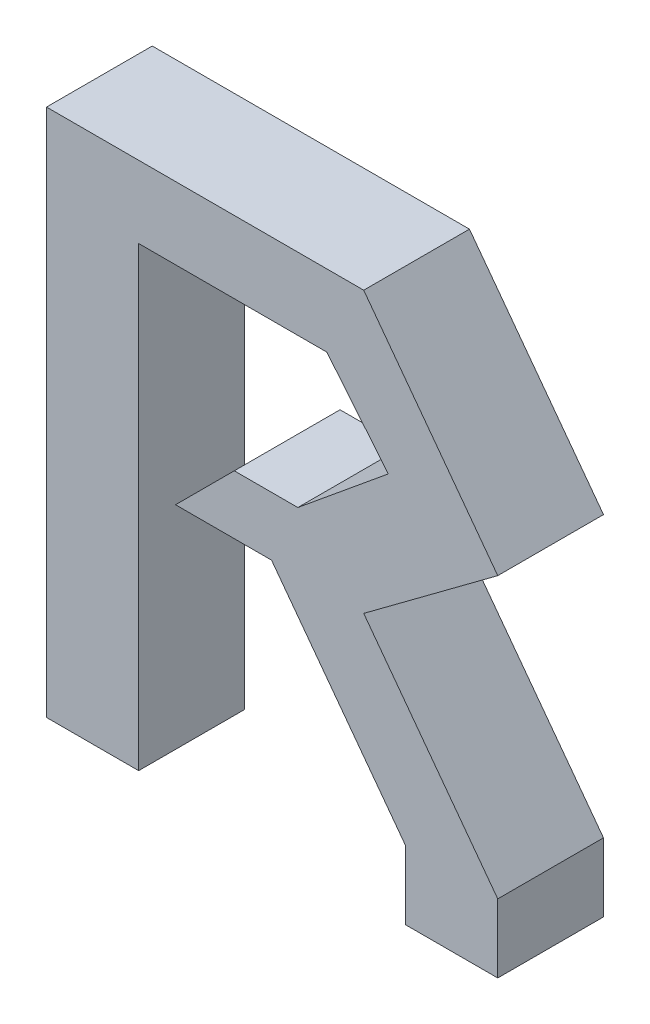
ISO-10303-21;
HEADER;
FILE_DESCRIPTION(('STEP AP214'),'2;1');
FILE_NAME('part.step','',(''),(''),'','','');
FILE_SCHEMA(('AUTOMOTIVE_DESIGN { 1 0 10303 214 1 1 1 1 }'));
ENDSEC;
DATA;
#1=APPLICATION_CONTEXT('core data for automotive mechanical design processes');
#2=APPLICATION_PROTOCOL_DEFINITION('international standard','automotive_design',2000,#1);
#3=PRODUCT_CONTEXT('',#1,'mechanical');
#4=PRODUCT('Part','Part','',(#3));
#5=PRODUCT_RELATED_PRODUCT_CATEGORY('part','',(#4));
#6=PRODUCT_DEFINITION_FORMATION('','',#4);
#7=PRODUCT_DEFINITION_CONTEXT('part definition',#1,'design');
#8=PRODUCT_DEFINITION('design','',#6,#7);
#9=PRODUCT_DEFINITION_SHAPE('','',#8);
#10=(LENGTH_UNIT() NAMED_UNIT(*) SI_UNIT(.MILLI.,.METRE.));
#11=(NAMED_UNIT(*) PLANE_ANGLE_UNIT() SI_UNIT($,.RADIAN.));
#12=(NAMED_UNIT(*) SI_UNIT($,.STERADIAN.) SOLID_ANGLE_UNIT());
#13=UNCERTAINTY_MEASURE_WITH_UNIT(LENGTH_MEASURE(1.E-05),#10,'distance_accuracy_value','');
#14=(GEOMETRIC_REPRESENTATION_CONTEXT(3) GLOBAL_UNCERTAINTY_ASSIGNED_CONTEXT((#13)) GLOBAL_UNIT_ASSIGNED_CONTEXT((#10,
#11,#12)) REPRESENTATION_CONTEXT('',''));
#15=CARTESIAN_POINT('',(0.,0.,0.));
#16=DIRECTION('',(0.,0.,1.));
#17=DIRECTION('',(1.,0.,0.));
#18=AXIS2_PLACEMENT_3D('',#15,#16,#17);
#19=CARTESIAN_POINT('',(-308.048152534404,51.5334819485926,20.));
#20=DIRECTION('',(1.,0.,0.));
#21=DIRECTION('',(0.,0.,-1.));
#22=AXIS2_PLACEMENT_3D('',#19,#20,#21);
#23=PLANE('',#22);
#24=DIRECTION('',(0.,-1.,0.));
#25=VECTOR('',#24,1.);
#26=CARTESIAN_POINT('',(-308.048152534404,51.5334819485926,0.));
#27=LINE('',#26,#25);
#28=CARTESIAN_POINT('',(-308.048152534404,51.5334819485926,0.));
#29=VERTEX_POINT('',#28);
#30=CARTESIAN_POINT('',(-308.048152534404,-48.4665180514074,0.));
#31=VERTEX_POINT('',#30);
#32=EDGE_CURVE('E185',#29,#31,#27,.T.);
#33=ORIENTED_EDGE('',*,*,#32,.T.);
#34=DIRECTION('',(0.,0.,-1.));
#35=VECTOR('',#34,1.);
#36=CARTESIAN_POINT('',(-308.048152534404,-48.4665180514074,20.));
#37=LINE('',#36,#35);
#38=CARTESIAN_POINT('',(-308.048152534404,-48.4665180514074,20.));
#39=VERTEX_POINT('',#38);
#40=EDGE_CURVE('E11',#39,#31,#37,.T.);
#41=ORIENTED_EDGE('',*,*,#40,.F.);
#42=DIRECTION('',(0.,-1.,0.));
#43=VECTOR('',#42,1.);
#44=CARTESIAN_POINT('',(-308.048152534404,51.5334819485926,20.));
#45=LINE('',#44,#43);
#46=CARTESIAN_POINT('',(-308.048152534404,51.5334819485926,20.));
#47=VERTEX_POINT('',#46);
#48=EDGE_CURVE('E227',#47,#39,#45,.T.);
#49=ORIENTED_EDGE('',*,*,#48,.F.);
#50=DIRECTION('',(0.,0.,-1.));
#51=VECTOR('',#50,1.);
#52=CARTESIAN_POINT('',(-308.048152534404,51.5334819485926,20.));
#53=LINE('',#52,#51);
#54=EDGE_CURVE('E50',#47,#29,#53,.T.);
#55=ORIENTED_EDGE('',*,*,#54,.T.);
#56=EDGE_LOOP('',(#33,#41,#49,#55));
#57=FACE_BOUND('',#56,.T.);
#58=ADVANCED_FACE('F34',(#57),#23,.F.);
#59=CARTESIAN_POINT('',(-308.048152534404,-48.4665180514074,20.));
#60=DIRECTION('',(0.,1.,0.));
#61=DIRECTION('',(0.,0.,1.));
#62=AXIS2_PLACEMENT_3D('',#59,#60,#61);
#63=PLANE('',#62);
#64=DIRECTION('',(1.,0.,0.));
#65=VECTOR('',#64,1.);
#66=CARTESIAN_POINT('',(-308.048152534404,-48.4665180514074,0.));
#67=LINE('',#66,#65);
#68=CARTESIAN_POINT('',(-290.618276034404,-48.4665180514074,0.));
#69=VERTEX_POINT('',#68);
#70=EDGE_CURVE('E187',#31,#69,#67,.T.);
#71=ORIENTED_EDGE('',*,*,#70,.T.);
#72=DIRECTION('',(0.,0.,-1.));
#73=VECTOR('',#72,1.);
#74=CARTESIAN_POINT('',(-290.618276034404,-48.4665180514074,20.));
#75=LINE('',#74,#73);
#76=CARTESIAN_POINT('',(-290.618276034404,-48.4665180514074,20.));
#77=VERTEX_POINT('',#76);
#78=EDGE_CURVE('E42',#77,#69,#75,.T.);
#79=ORIENTED_EDGE('',*,*,#78,.F.);
#80=DIRECTION('',(1.,0.,0.));
#81=VECTOR('',#80,1.);
#82=CARTESIAN_POINT('',(-308.048152534404,-48.4665180514074,20.));
#83=LINE('',#82,#81);
#84=EDGE_CURVE('E115',#39,#77,#83,.T.);
#85=ORIENTED_EDGE('',*,*,#84,.F.);
#86=ORIENTED_EDGE('',*,*,#40,.T.);
#87=EDGE_LOOP('',(#71,#79,#85,#86));
#88=FACE_BOUND('',#87,.T.);
#89=ADVANCED_FACE('F319',(#88),#63,.F.);
#90=CARTESIAN_POINT('',(-290.618276034404,-48.4665180514074,20.));
#91=DIRECTION('',(-1.,0.,0.));
#92=DIRECTION('',(0.,0.,1.));
#93=AXIS2_PLACEMENT_3D('',#90,#91,#92);
#94=PLANE('',#93);
#95=DIRECTION('',(0.,1.,0.));
#96=VECTOR('',#95,1.);
#97=CARTESIAN_POINT('',(-290.618276034404,-48.4665180514074,0.));
#98=LINE('',#97,#96);
#99=CARTESIAN_POINT('',(-290.618276034404,37.897118312229,0.));
#100=VERTEX_POINT('',#99);
#101=EDGE_CURVE('E189',#69,#100,#98,.T.);
#102=ORIENTED_EDGE('',*,*,#101,.T.);
#103=DIRECTION('',(0.,0.,-1.));
#104=VECTOR('',#103,1.);
#105=CARTESIAN_POINT('',(-290.618276034404,37.897118312229,20.));
#106=LINE('',#105,#104);
#107=CARTESIAN_POINT('',(-290.618276034404,37.897118312229,20.));
#108=VERTEX_POINT('',#107);
#109=EDGE_CURVE('E254',#108,#100,#106,.T.);
#110=ORIENTED_EDGE('',*,*,#109,.F.);
#111=DIRECTION('',(0.,1.,0.));
#112=VECTOR('',#111,1.);
#113=CARTESIAN_POINT('',(-290.618276034404,-48.4665180514074,20.));
#114=LINE('',#113,#112);
#115=EDGE_CURVE('E262',#77,#108,#114,.T.);
#116=ORIENTED_EDGE('',*,*,#115,.F.);
#117=ORIENTED_EDGE('',*,*,#78,.T.);
#118=EDGE_LOOP('',(#102,#110,#116,#117));
#119=FACE_BOUND('',#118,.T.);
#120=ADVANCED_FACE('F260',(#119),#94,.F.);
#121=CARTESIAN_POINT('',(-290.618276034404,37.897118312229,20.));
#122=DIRECTION('',(0.,1.,0.));
#123=DIRECTION('',(0.,0.,1.));
#124=AXIS2_PLACEMENT_3D('',#121,#122,#123);
#125=PLANE('',#124);
#126=DIRECTION('',(1.,0.,0.));
#127=VECTOR('',#126,1.);
#128=CARTESIAN_POINT('',(-290.618276034404,37.897118312229,0.));
#129=LINE('',#128,#127);
#130=CARTESIAN_POINT('',(-255.017849504101,37.897118312229,0.));
#131=VERTEX_POINT('',#130);
#132=EDGE_CURVE('E191',#100,#131,#129,.T.);
#133=ORIENTED_EDGE('',*,*,#132,.T.);
#134=DIRECTION('',(0.,0.,-1.));
#135=VECTOR('',#134,1.);
#136=CARTESIAN_POINT('',(-255.017849504101,37.897118312229,20.));
#137=LINE('',#136,#135);
#138=CARTESIAN_POINT('',(-255.017849504101,37.897118312229,20.));
#139=VERTEX_POINT('',#138);
#140=EDGE_CURVE('E251',#139,#131,#137,.T.);
#141=ORIENTED_EDGE('',*,*,#140,.F.);
#142=DIRECTION('',(1.,0.,0.));
#143=VECTOR('',#142,1.);
#144=CARTESIAN_POINT('',(-290.618276034404,37.897118312229,20.));
#145=LINE('',#144,#143);
#146=EDGE_CURVE('E279',#108,#139,#145,.T.);
#147=ORIENTED_EDGE('',*,*,#146,.F.);
#148=ORIENTED_EDGE('',*,*,#109,.T.);
#149=EDGE_LOOP('',(#133,#141,#147,#148));
#150=FACE_BOUND('',#149,.T.);
#151=ADVANCED_FACE('F270',(#150),#125,.F.);
#152=CARTESIAN_POINT('',(-255.017849504101,37.897118312229,20.));
#153=DIRECTION('',(0.772726254525235,0.634739423360013,0.));
#154=DIRECTION('',(-0.634739423360013,0.772726254525235,0.));
#155=AXIS2_PLACEMENT_3D('',#152,#153,#154);
#156=PLANE('',#155);
#157=DIRECTION('',(0.634739423360013,-0.772726254525235,0.));
#158=VECTOR('',#157,1.);
#159=CARTESIAN_POINT('',(-255.017849504101,37.897118312229,0.));
#160=LINE('',#159,#158);
#161=CARTESIAN_POINT('',(-243.40168788794,23.7557041708148,0.));
#162=VERTEX_POINT('',#161);
#163=EDGE_CURVE('E193',#131,#162,#160,.T.);
#164=ORIENTED_EDGE('',*,*,#163,.T.);
#165=DIRECTION('',(0.,0.,-1.));
#166=VECTOR('',#165,1.);
#167=CARTESIAN_POINT('',(-243.40168788794,23.7557041708148,20.));
#168=LINE('',#167,#166);
#169=CARTESIAN_POINT('',(-243.40168788794,23.7557041708148,20.));
#170=VERTEX_POINT('',#169);
#171=EDGE_CURVE('E248',#170,#162,#168,.T.);
#172=ORIENTED_EDGE('',*,*,#171,.F.);
#173=DIRECTION('',(0.634739423360013,-0.772726254525235,0.));
#174=VECTOR('',#173,1.);
#175=CARTESIAN_POINT('',(-255.017849504101,37.897118312229,20.));
#176=LINE('',#175,#174);
#177=EDGE_CURVE('E276',#139,#170,#176,.T.);
#178=ORIENTED_EDGE('',*,*,#177,.F.);
#179=ORIENTED_EDGE('',*,*,#140,.T.);
#180=EDGE_LOOP('',(#164,#172,#178,#179));
#181=FACE_BOUND('',#180,.T.);
#182=ADVANCED_FACE('F274',(#181),#156,.F.);
#183=CARTESIAN_POINT('',(-243.40168788794,23.7557041708148,20.));
#184=DIRECTION('',(0.634739423360013,-0.772726254525235,0.));
#185=DIRECTION('',(0.772726254525235,0.634739423360013,0.));
#186=AXIS2_PLACEMENT_3D('',#183,#184,#185);
#187=PLANE('',#186);
#188=DIRECTION('',(-0.772726254525235,-0.634739423360013,0.));
#189=VECTOR('',#188,1.);
#190=CARTESIAN_POINT('',(-243.40168788794,23.7557041708148,0.));
#191=LINE('',#190,#189);
#192=CARTESIAN_POINT('',(-260.510631621456,9.70192896114109,0.));
#193=VERTEX_POINT('',#192);
#194=EDGE_CURVE('E195',#162,#193,#191,.T.);
#195=ORIENTED_EDGE('',*,*,#194,.T.);
#196=DIRECTION('',(0.,0.,-1.));
#197=VECTOR('',#196,1.);
#198=CARTESIAN_POINT('',(-260.510631621456,9.70192896114109,20.));
#199=LINE('',#198,#197);
#200=CARTESIAN_POINT('',(-260.510631621456,9.70192896114109,20.));
#201=VERTEX_POINT('',#200);
#202=EDGE_CURVE('E245',#201,#193,#199,.T.);
#203=ORIENTED_EDGE('',*,*,#202,.F.);
#204=DIRECTION('',(-0.772726254525235,-0.634739423360013,0.));
#205=VECTOR('',#204,1.);
#206=CARTESIAN_POINT('',(-243.40168788794,23.7557041708148,20.));
#207=LINE('',#206,#205);
#208=EDGE_CURVE('E278',#170,#201,#207,.T.);
#209=ORIENTED_EDGE('',*,*,#208,.F.);
#210=ORIENTED_EDGE('',*,*,#171,.T.);
#211=EDGE_LOOP('',(#195,#203,#209,#210));
#212=FACE_BOUND('',#211,.T.);
#213=ADVANCED_FACE('F335',(#212),#187,.F.);
#214=CARTESIAN_POINT('',(-260.510631621456,9.70192896114109,20.));
#215=DIRECTION('',(0.,-1.,0.));
#216=DIRECTION('',(1.,0.,0.));
#217=AXIS2_PLACEMENT_3D('',#214,#215,#216);
#218=PLANE('',#217);
#219=DIRECTION('',(-1.,0.,0.));
#220=VECTOR('',#219,1.);
#221=CARTESIAN_POINT('',(-260.510631621456,9.70192896114109,0.));
#222=LINE('',#221,#220);
#223=CARTESIAN_POINT('',(-272.529730860084,9.70192896114109,0.));
#224=VERTEX_POINT('',#223);
#225=EDGE_CURVE('E197',#193,#224,#222,.T.);
#226=ORIENTED_EDGE('',*,*,#225,.T.);
#227=DIRECTION('',(0.,0.,-1.));
#228=VECTOR('',#227,1.);
#229=CARTESIAN_POINT('',(-272.529730860084,9.70192896114109,20.));
#230=LINE('',#229,#228);
#231=CARTESIAN_POINT('',(-272.529730860084,9.70192896114109,20.));
#232=VERTEX_POINT('',#231);
#233=EDGE_CURVE('E243',#232,#224,#230,.T.);
#234=ORIENTED_EDGE('',*,*,#233,.F.);
#235=DIRECTION('',(-1.,0.,0.));
#236=VECTOR('',#235,1.);
#237=CARTESIAN_POINT('',(-260.510631621456,9.70192896114109,20.));
#238=LINE('',#237,#236);
#239=EDGE_CURVE('E281',#201,#232,#238,.T.);
#240=ORIENTED_EDGE('',*,*,#239,.F.);
#241=ORIENTED_EDGE('',*,*,#202,.T.);
#242=EDGE_LOOP('',(#226,#234,#240,#241));
#243=FACE_BOUND('',#242,.T.);
#244=ADVANCED_FACE('F338',(#243),#218,.F.);
#245=CARTESIAN_POINT('',(-283.644605107949,-1.41294528672358,20.));
#246=DIRECTION('',(-0.707106781186547,0.707106781186548,0.));
#247=DIRECTION('',(-0.707106781186548,-0.707106781186547,0.));
#248=AXIS2_PLACEMENT_3D('',#245,#246,#247);
#249=PLANE('',#248);
#250=DIRECTION('',(0.707106781186548,0.707106781186547,0.));
#251=VECTOR('',#250,1.);
#252=CARTESIAN_POINT('',(-283.644605107949,-1.41294528672358,0.));
#253=LINE('',#252,#251);
#254=CARTESIAN_POINT('',(-283.644605107949,-1.41294528672358,0.));
#255=VERTEX_POINT('',#254);
#256=EDGE_CURVE('E200',#255,#224,#253,.T.);
#257=ORIENTED_EDGE('',*,*,#256,.F.);
#258=DIRECTION('',(0.,0.,-1.));
#259=VECTOR('',#258,1.);
#260=CARTESIAN_POINT('',(-283.644605107949,-1.41294528672358,20.));
#261=LINE('',#260,#259);
#262=CARTESIAN_POINT('',(-283.644605107949,-1.41294528672358,20.));
#263=VERTEX_POINT('',#262);
#264=EDGE_CURVE('E241',#263,#255,#261,.T.);
#265=ORIENTED_EDGE('',*,*,#264,.F.);
#266=DIRECTION('',(0.707106781186548,0.707106781186547,0.));
#267=VECTOR('',#266,1.);
#268=CARTESIAN_POINT('',(-283.644605107949,-1.41294528672358,20.));
#269=LINE('',#268,#267);
#270=EDGE_CURVE('E287',#263,#232,#269,.T.);
#271=ORIENTED_EDGE('',*,*,#270,.T.);
#272=ORIENTED_EDGE('',*,*,#233,.T.);
#273=EDGE_LOOP('',(#257,#265,#271,#272));
#274=FACE_BOUND('',#273,.T.);
#275=ADVANCED_FACE('F342',(#274),#249,.T.);
#276=CARTESIAN_POINT('',(-265.478028988185,-1.41294528672358,20.));
#277=DIRECTION('',(0.,-1.,0.));
#278=DIRECTION('',(1.,0.,0.));
#279=AXIS2_PLACEMENT_3D('',#276,#277,#278);
#280=PLANE('',#279);
#281=DIRECTION('',(-1.,0.,0.));
#282=VECTOR('',#281,1.);
#283=CARTESIAN_POINT('',(-265.478028988185,-1.41294528672358,0.));
#284=LINE('',#283,#282);
#285=CARTESIAN_POINT('',(-265.478028988185,-1.41294528672358,0.));
#286=VERTEX_POINT('',#285);
#287=EDGE_CURVE('E203',#286,#255,#284,.T.);
#288=ORIENTED_EDGE('',*,*,#287,.F.);
#289=DIRECTION('',(0.,0.,-1.));
#290=VECTOR('',#289,1.);
#291=CARTESIAN_POINT('',(-265.478028988185,-1.41294528672358,20.));
#292=LINE('',#291,#290);
#293=CARTESIAN_POINT('',(-265.478028988185,-1.41294528672358,20.));
#294=VERTEX_POINT('',#293);
#295=EDGE_CURVE('E239',#294,#286,#292,.T.);
#296=ORIENTED_EDGE('',*,*,#295,.F.);
#297=DIRECTION('',(-1.,0.,0.));
#298=VECTOR('',#297,1.);
#299=CARTESIAN_POINT('',(-265.478028988185,-1.41294528672358,20.));
#300=LINE('',#299,#298);
#301=EDGE_CURVE('E290',#294,#263,#300,.T.);
#302=ORIENTED_EDGE('',*,*,#301,.T.);
#303=ORIENTED_EDGE('',*,*,#264,.T.);
#304=EDGE_LOOP('',(#288,#296,#302,#303));
#305=FACE_BOUND('',#304,.T.);
#306=ADVANCED_FACE('F346',(#305),#280,.T.);
#307=CARTESIAN_POINT('',(-240.12449363465,-35.5038543776325,20.));
#308=DIRECTION('',(-0.802418552657078,-0.596761649531637,0.));
#309=DIRECTION('',(0.596761649531637,-0.802418552657078,0.));
#310=AXIS2_PLACEMENT_3D('',#307,#308,#309);
#311=PLANE('',#310);
#312=DIRECTION('',(-0.596761649531637,0.802418552657078,0.));
#313=VECTOR('',#312,1.);
#314=CARTESIAN_POINT('',(-240.12449363465,-35.5038543776325,0.));
#315=LINE('',#314,#313);
#316=CARTESIAN_POINT('',(-240.12449363465,-35.5038543776325,0.));
#317=VERTEX_POINT('',#316);
#318=EDGE_CURVE('E206',#317,#286,#315,.T.);
#319=ORIENTED_EDGE('',*,*,#318,.F.);
#320=DIRECTION('',(0.,0.,-1.));
#321=VECTOR('',#320,1.);
#322=CARTESIAN_POINT('',(-240.12449363465,-35.5038543776325,20.));
#323=LINE('',#322,#321);
#324=CARTESIAN_POINT('',(-240.12449363465,-35.5038543776325,20.));
#325=VERTEX_POINT('',#324);
#326=EDGE_CURVE('E237',#325,#317,#323,.T.);
#327=ORIENTED_EDGE('',*,*,#326,.F.);
#328=DIRECTION('',(-0.596761649531637,0.802418552657078,0.));
#329=VECTOR('',#328,1.);
#330=CARTESIAN_POINT('',(-240.12449363465,-35.5038543776325,20.));
#331=LINE('',#330,#329);
#332=EDGE_CURVE('E293',#325,#294,#331,.T.);
#333=ORIENTED_EDGE('',*,*,#332,.T.);
#334=ORIENTED_EDGE('',*,*,#295,.T.);
#335=EDGE_LOOP('',(#319,#327,#333,#334));
#336=FACE_BOUND('',#335,.T.);
#337=ADVANCED_FACE('F350',(#336),#311,.T.);
#338=CARTESIAN_POINT('',(-240.12449363465,-48.4665180514074,20.));
#339=DIRECTION('',(-1.,0.,0.));
#340=DIRECTION('',(0.,0.,1.));
#341=AXIS2_PLACEMENT_3D('',#338,#339,#340);
#342=PLANE('',#341);
#343=DIRECTION('',(0.,1.,0.));
#344=VECTOR('',#343,1.);
#345=CARTESIAN_POINT('',(-240.12449363465,-48.4665180514074,0.));
#346=LINE('',#345,#344);
#347=CARTESIAN_POINT('',(-240.12449363465,-48.4665180514074,0.));
#348=VERTEX_POINT('',#347);
#349=EDGE_CURVE('E209',#348,#317,#346,.T.);
#350=ORIENTED_EDGE('',*,*,#349,.F.);
#351=DIRECTION('',(0.,0.,-1.));
#352=VECTOR('',#351,1.);
#353=CARTESIAN_POINT('',(-240.12449363465,-48.4665180514074,20.));
#354=LINE('',#353,#352);
#355=CARTESIAN_POINT('',(-240.12449363465,-48.4665180514074,20.));
#356=VERTEX_POINT('',#355);
#357=EDGE_CURVE('E235',#356,#348,#354,.T.);
#358=ORIENTED_EDGE('',*,*,#357,.F.);
#359=DIRECTION('',(0.,1.,0.));
#360=VECTOR('',#359,1.);
#361=CARTESIAN_POINT('',(-240.12449363465,-48.4665180514074,20.));
#362=LINE('',#361,#360);
#363=EDGE_CURVE('E296',#356,#325,#362,.T.);
#364=ORIENTED_EDGE('',*,*,#363,.T.);
#365=ORIENTED_EDGE('',*,*,#326,.T.);
#366=EDGE_LOOP('',(#350,#358,#364,#365));
#367=FACE_BOUND('',#366,.T.);
#368=ADVANCED_FACE('F354',(#367),#342,.T.);
#369=CARTESIAN_POINT('',(-222.694617180869,-48.4665180514074,20.));
#370=DIRECTION('',(0.,-1.,0.));
#371=DIRECTION('',(0.,0.,-1.));
#372=AXIS2_PLACEMENT_3D('',#369,#370,#371);
#373=PLANE('',#372);
#374=DIRECTION('',(-1.,0.,0.));
#375=VECTOR('',#374,1.);
#376=CARTESIAN_POINT('',(-222.694617180869,-48.4665180514074,0.));
#377=LINE('',#376,#375);
#378=CARTESIAN_POINT('',(-222.694617180869,-48.4665180514074,0.));
#379=VERTEX_POINT('',#378);
#380=EDGE_CURVE('E212',#379,#348,#377,.T.);
#381=ORIENTED_EDGE('',*,*,#380,.F.);
#382=DIRECTION('',(0.,0.,-1.));
#383=VECTOR('',#382,1.);
#384=CARTESIAN_POINT('',(-222.694617180869,-48.4665180514074,20.));
#385=LINE('',#384,#383);
#386=CARTESIAN_POINT('',(-222.694617180869,-48.4665180514074,20.));
#387=VERTEX_POINT('',#386);
#388=EDGE_CURVE('E233',#387,#379,#385,.T.);
#389=ORIENTED_EDGE('',*,*,#388,.F.);
#390=DIRECTION('',(-1.,0.,0.));
#391=VECTOR('',#390,1.);
#392=CARTESIAN_POINT('',(-222.694617180869,-48.4665180514074,20.));
#393=LINE('',#392,#391);
#394=EDGE_CURVE('E299',#387,#356,#393,.T.);
#395=ORIENTED_EDGE('',*,*,#394,.T.);
#396=ORIENTED_EDGE('',*,*,#357,.T.);
#397=EDGE_LOOP('',(#381,#389,#395,#396));
#398=FACE_BOUND('',#397,.T.);
#399=ADVANCED_FACE('F358',(#398),#373,.T.);
#400=CARTESIAN_POINT('',(-222.694617180869,-35.5038543776322,20.));
#401=DIRECTION('',(1.,0.,0.));
#402=DIRECTION('',(0.,0.,-1.));
#403=AXIS2_PLACEMENT_3D('',#400,#401,#402);
#404=PLANE('',#403);
#405=DIRECTION('',(0.,-1.,0.));
#406=VECTOR('',#405,1.);
#407=CARTESIAN_POINT('',(-222.694617180869,-35.5038543776322,0.));
#408=LINE('',#407,#406);
#409=CARTESIAN_POINT('',(-222.694617180869,-35.5038543776322,0.));
#410=VERTEX_POINT('',#409);
#411=EDGE_CURVE('E215',#410,#379,#408,.T.);
#412=ORIENTED_EDGE('',*,*,#411,.F.);
#413=DIRECTION('',(0.,0.,-1.));
#414=VECTOR('',#413,1.);
#415=CARTESIAN_POINT('',(-222.694617180869,-35.5038543776322,20.));
#416=LINE('',#415,#414);
#417=CARTESIAN_POINT('',(-222.694617180869,-35.5038543776322,20.));
#418=VERTEX_POINT('',#417);
#419=EDGE_CURVE('E231',#418,#410,#416,.T.);
#420=ORIENTED_EDGE('',*,*,#419,.F.);
#421=DIRECTION('',(0.,-1.,0.));
#422=VECTOR('',#421,1.);
#423=CARTESIAN_POINT('',(-222.694617180869,-35.5038543776322,20.));
#424=LINE('',#423,#422);
#425=EDGE_CURVE('E302',#418,#387,#424,.T.);
#426=ORIENTED_EDGE('',*,*,#425,.T.);
#427=ORIENTED_EDGE('',*,*,#388,.T.);
#428=EDGE_LOOP('',(#412,#420,#426,#427));
#429=FACE_BOUND('',#428,.T.);
#430=ADVANCED_FACE('F362',(#429),#404,.T.);
#431=CARTESIAN_POINT('',(-248.048152534404,-1.41294528672355,20.));
#432=DIRECTION('',(0.802418552657077,0.596761649531638,0.));
#433=DIRECTION('',(-0.596761649531638,0.802418552657077,0.));
#434=AXIS2_PLACEMENT_3D('',#431,#432,#433);
#435=PLANE('',#434);
#436=DIRECTION('',(0.596761649531638,-0.802418552657077,0.));
#437=VECTOR('',#436,1.);
#438=CARTESIAN_POINT('',(-248.048152534404,-1.41294528672355,0.));
#439=LINE('',#438,#437);
#440=CARTESIAN_POINT('',(-248.048152534404,-1.41294528672355,0.));
#441=VERTEX_POINT('',#440);
#442=EDGE_CURVE('E218',#441,#410,#439,.T.);
#443=ORIENTED_EDGE('',*,*,#442,.F.);
#444=DIRECTION('',(0.,0.,-1.));
#445=VECTOR('',#444,1.);
#446=CARTESIAN_POINT('',(-248.048152534404,-1.41294528672355,20.));
#447=LINE('',#446,#445);
#448=CARTESIAN_POINT('',(-248.048152534404,-1.41294528672355,20.));
#449=VERTEX_POINT('',#448);
#450=EDGE_CURVE('E167',#449,#441,#447,.T.);
#451=ORIENTED_EDGE('',*,*,#450,.F.);
#452=DIRECTION('',(0.596761649531638,-0.802418552657077,0.));
#453=VECTOR('',#452,1.);
#454=CARTESIAN_POINT('',(-248.048152534404,-1.41294528672355,20.));
#455=LINE('',#454,#453);
#456=EDGE_CURVE('E177',#449,#418,#455,.T.);
#457=ORIENTED_EDGE('',*,*,#456,.T.);
#458=ORIENTED_EDGE('',*,*,#419,.T.);
#459=EDGE_LOOP('',(#443,#451,#457,#458));
#460=FACE_BOUND('',#459,.T.);
#461=ADVANCED_FACE('F306',(#460),#435,.T.);
#462=CARTESIAN_POINT('',(-222.694617180869,17.4425728576836,20.));
#463=DIRECTION('',(0.596761649531638,-0.802418552657077,0.));
#464=DIRECTION('',(0.802418552657077,0.596761649531638,0.));
#465=AXIS2_PLACEMENT_3D('',#462,#463,#464);
#466=PLANE('',#465);
#467=DIRECTION('',(-0.802418552657077,-0.596761649531638,0.));
#468=VECTOR('',#467,1.);
#469=CARTESIAN_POINT('',(-222.694617180869,17.4425728576836,0.));
#470=LINE('',#469,#468);
#471=CARTESIAN_POINT('',(-222.694617180869,17.4425728576836,0.));
#472=VERTEX_POINT('',#471);
#473=EDGE_CURVE('E163',#472,#441,#470,.T.);
#474=ORIENTED_EDGE('',*,*,#473,.F.);
#475=DIRECTION('',(0.,0.,-1.));
#476=VECTOR('',#475,1.);
#477=CARTESIAN_POINT('',(-222.694617180869,17.4425728576836,20.));
#478=LINE('',#477,#476);
#479=CARTESIAN_POINT('',(-222.694617180869,17.4425728576836,20.));
#480=VERTEX_POINT('',#479);
#481=EDGE_CURVE('E158',#480,#472,#478,.T.);
#482=ORIENTED_EDGE('',*,*,#481,.F.);
#483=DIRECTION('',(-0.802418552657077,-0.596761649531638,0.));
#484=VECTOR('',#483,1.);
#485=CARTESIAN_POINT('',(-222.694617180869,17.4425728576836,20.));
#486=LINE('',#485,#484);
#487=EDGE_CURVE('E161',#480,#449,#486,.T.);
#488=ORIENTED_EDGE('',*,*,#487,.T.);
#489=ORIENTED_EDGE('',*,*,#450,.T.);
#490=EDGE_LOOP('',(#474,#482,#488,#489));
#491=FACE_BOUND('',#490,.T.);
#492=ADVANCED_FACE('F160',(#491),#466,.T.);
#493=CARTESIAN_POINT('',(-248.048152534404,51.5334819485926,20.));
#494=DIRECTION('',(0.802418552657078,0.596761649531637,0.));
#495=DIRECTION('',(-0.596761649531637,0.802418552657078,0.));
#496=AXIS2_PLACEMENT_3D('',#493,#494,#495);
#497=PLANE('',#496);
#498=DIRECTION('',(0.596761649531637,-0.802418552657078,0.));
#499=VECTOR('',#498,1.);
#500=CARTESIAN_POINT('',(-248.048152534404,51.5334819485926,0.));
#501=LINE('',#500,#499);
#502=CARTESIAN_POINT('',(-248.048152534404,51.5334819485926,0.));
#503=VERTEX_POINT('',#502);
#504=EDGE_CURVE('E222',#503,#472,#501,.T.);
#505=ORIENTED_EDGE('',*,*,#504,.F.);
#506=DIRECTION('',(0.,0.,-1.));
#507=VECTOR('',#506,1.);
#508=CARTESIAN_POINT('',(-248.048152534404,51.5334819485926,20.));
#509=LINE('',#508,#507);
#510=CARTESIAN_POINT('',(-248.048152534404,51.5334819485926,20.));
#511=VERTEX_POINT('',#510);
#512=EDGE_CURVE('E103',#511,#503,#509,.T.);
#513=ORIENTED_EDGE('',*,*,#512,.F.);
#514=DIRECTION('',(0.596761649531637,-0.802418552657078,0.));
#515=VECTOR('',#514,1.);
#516=CARTESIAN_POINT('',(-248.048152534404,51.5334819485926,20.));
#517=LINE('',#516,#515);
#518=EDGE_CURVE('E174',#511,#480,#517,.T.);
#519=ORIENTED_EDGE('',*,*,#518,.T.);
#520=ORIENTED_EDGE('',*,*,#481,.T.);
#521=EDGE_LOOP('',(#505,#513,#519,#520));
#522=FACE_BOUND('',#521,.T.);
#523=ADVANCED_FACE('F179',(#522),#497,.T.);
#524=CARTESIAN_POINT('',(-308.048152534404,51.5334819485926,20.));
#525=DIRECTION('',(0.,1.,0.));
#526=DIRECTION('',(0.,0.,1.));
#527=AXIS2_PLACEMENT_3D('',#524,#525,#526);
#528=PLANE('',#527);
#529=DIRECTION('',(1.,0.,0.));
#530=VECTOR('',#529,1.);
#531=CARTESIAN_POINT('',(-308.048152534404,51.5334819485926,0.));
#532=LINE('',#531,#530);
#533=EDGE_CURVE('E224',#29,#503,#532,.T.);
#534=ORIENTED_EDGE('',*,*,#533,.F.);
#535=ORIENTED_EDGE('',*,*,#54,.F.);
#536=DIRECTION('',(1.,0.,0.));
#537=VECTOR('',#536,1.);
#538=CARTESIAN_POINT('',(-308.048152534404,51.5334819485926,20.));
#539=LINE('',#538,#537);
#540=EDGE_CURVE('E180',#47,#511,#539,.T.);
#541=ORIENTED_EDGE('',*,*,#540,.T.);
#542=ORIENTED_EDGE('',*,*,#512,.T.);
#543=EDGE_LOOP('',(#534,#535,#541,#542));
#544=FACE_BOUND('',#543,.T.);
#545=ADVANCED_FACE('F308',(#544),#528,.T.);
#546=CARTESIAN_POINT('',(0.,0.,20.));
#547=DIRECTION('',(0.,0.,1.));
#548=DIRECTION('',(1.,0.,0.));
#549=AXIS2_PLACEMENT_3D('',#546,#547,#548);
#550=PLANE('',#549);
#551=ORIENTED_EDGE('',*,*,#48,.T.);
#552=ORIENTED_EDGE('',*,*,#84,.T.);
#553=ORIENTED_EDGE('',*,*,#115,.T.);
#554=ORIENTED_EDGE('',*,*,#146,.T.);
#555=ORIENTED_EDGE('',*,*,#177,.T.);
#556=ORIENTED_EDGE('',*,*,#208,.T.);
#557=ORIENTED_EDGE('',*,*,#239,.T.);
#558=ORIENTED_EDGE('',*,*,#270,.F.);
#559=ORIENTED_EDGE('',*,*,#301,.F.);
#560=ORIENTED_EDGE('',*,*,#332,.F.);
#561=ORIENTED_EDGE('',*,*,#363,.F.);
#562=ORIENTED_EDGE('',*,*,#394,.F.);
#563=ORIENTED_EDGE('',*,*,#425,.F.);
#564=ORIENTED_EDGE('',*,*,#456,.F.);
#565=ORIENTED_EDGE('',*,*,#487,.F.);
#566=ORIENTED_EDGE('',*,*,#518,.F.);
#567=ORIENTED_EDGE('',*,*,#540,.F.);
#568=EDGE_LOOP('',(#551,#552,#553,#554,#555,#556,#557,#558,#559,#560,#561,#562,#563,#564,#565,
#566,#567));
#569=FACE_BOUND('',#568,.T.);
#570=ADVANCED_FACE('F172',(#569),#550,.T.);
#571=CARTESIAN_POINT('',(0.,0.,0.));
#572=DIRECTION('',(0.,0.,1.));
#573=DIRECTION('',(1.,0.,0.));
#574=AXIS2_PLACEMENT_3D('',#571,#572,#573);
#575=PLANE('',#574);
#576=ORIENTED_EDGE('',*,*,#32,.F.);
#577=ORIENTED_EDGE('',*,*,#533,.T.);
#578=ORIENTED_EDGE('',*,*,#504,.T.);
#579=ORIENTED_EDGE('',*,*,#473,.T.);
#580=ORIENTED_EDGE('',*,*,#442,.T.);
#581=ORIENTED_EDGE('',*,*,#411,.T.);
#582=ORIENTED_EDGE('',*,*,#380,.T.);
#583=ORIENTED_EDGE('',*,*,#349,.T.);
#584=ORIENTED_EDGE('',*,*,#318,.T.);
#585=ORIENTED_EDGE('',*,*,#287,.T.);
#586=ORIENTED_EDGE('',*,*,#256,.T.);
#587=ORIENTED_EDGE('',*,*,#225,.F.);
#588=ORIENTED_EDGE('',*,*,#194,.F.);
#589=ORIENTED_EDGE('',*,*,#163,.F.);
#590=ORIENTED_EDGE('',*,*,#132,.F.);
#591=ORIENTED_EDGE('',*,*,#101,.F.);
#592=ORIENTED_EDGE('',*,*,#70,.F.);
#593=EDGE_LOOP('',(#576,#577,#578,#579,#580,#581,#582,#583,#584,#585,#586,#587,#588,#589,#590,
#591,#592));
#594=FACE_BOUND('',#593,.T.);
#595=ADVANCED_FACE('F265',(#594),#575,.F.);
#596=CLOSED_SHELL('',(#58,#89,#120,#151,#182,#213,#244,#275,#306,#337,#368,#399,#430,#461,#492,
#523,#545,#570,#595));
#597=MANIFOLD_SOLID_BREP('B2',#596);
#598=ADVANCED_BREP_SHAPE_REPRESENTATION('',(#18,#597),#14);
#599=SHAPE_DEFINITION_REPRESENTATION(#9,#598);
ENDSEC;
END-ISO-10303-21;
